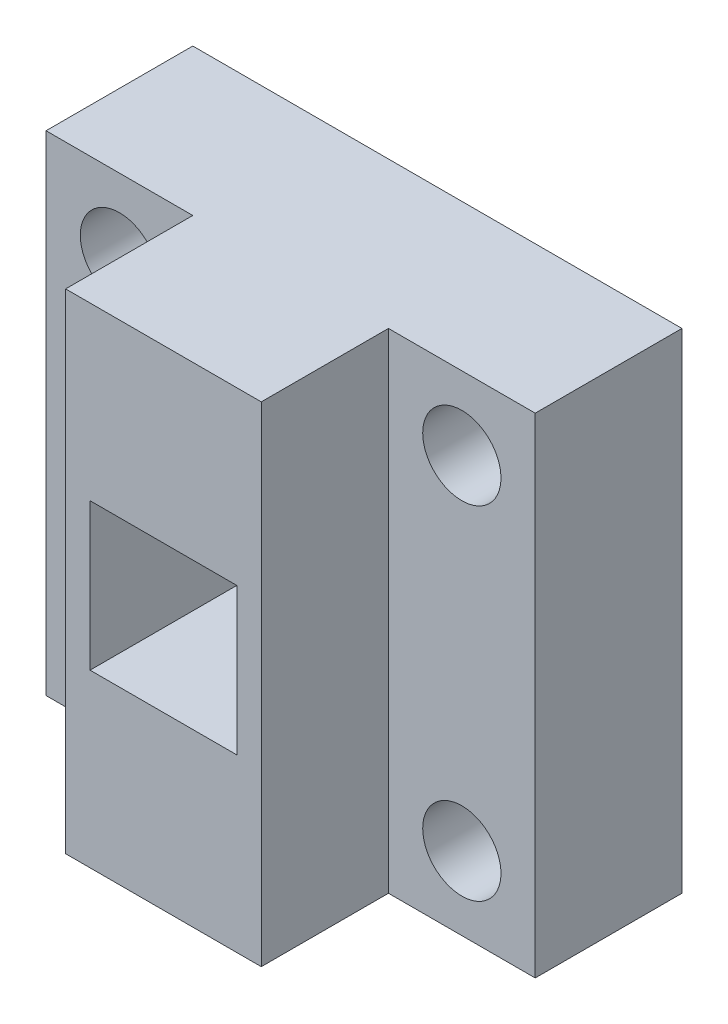
ISO-10303-21;
HEADER;
FILE_DESCRIPTION(('STEP AP214'),'2;1');
FILE_NAME('part.step','',(''),(''),'','','');
FILE_SCHEMA(('AUTOMOTIVE_DESIGN { 1 0 10303 214 1 1 1 1 }'));
ENDSEC;
DATA;
#1=APPLICATION_CONTEXT('core data for automotive mechanical design processes');
#2=APPLICATION_PROTOCOL_DEFINITION('international standard','automotive_design',2000,#1);
#3=PRODUCT_CONTEXT('',#1,'mechanical');
#4=PRODUCT('Part','Part','',(#3));
#5=PRODUCT_RELATED_PRODUCT_CATEGORY('part','',(#4));
#6=PRODUCT_DEFINITION_FORMATION('','',#4);
#7=PRODUCT_DEFINITION_CONTEXT('part definition',#1,'design');
#8=PRODUCT_DEFINITION('design','',#6,#7);
#9=PRODUCT_DEFINITION_SHAPE('','',#8);
#10=(LENGTH_UNIT() NAMED_UNIT(*) SI_UNIT(.MILLI.,.METRE.));
#11=(NAMED_UNIT(*) PLANE_ANGLE_UNIT() SI_UNIT($,.RADIAN.));
#12=(NAMED_UNIT(*) SI_UNIT($,.STERADIAN.) SOLID_ANGLE_UNIT());
#13=UNCERTAINTY_MEASURE_WITH_UNIT(LENGTH_MEASURE(1.E-05),#10,'distance_accuracy_value','');
#14=(GEOMETRIC_REPRESENTATION_CONTEXT(3) GLOBAL_UNCERTAINTY_ASSIGNED_CONTEXT((#13)) GLOBAL_UNIT_ASSIGNED_CONTEXT((#10,
#11,#12)) REPRESENTATION_CONTEXT('',''));
#15=CARTESIAN_POINT('',(0.,0.,0.));
#16=DIRECTION('',(0.,0.,1.));
#17=DIRECTION('',(1.,0.,0.));
#18=AXIS2_PLACEMENT_3D('',#15,#16,#17);
#19=CARTESIAN_POINT('',(0.,0.,0.));
#20=DIRECTION('',(0.,0.,-1.));
#21=DIRECTION('',(-1.,0.,0.));
#22=AXIS2_PLACEMENT_3D('',#19,#20,#21);
#23=PLANE('',#22);
#24=CARTESIAN_POINT('',(17.5,17.5,0.));
#25=DIRECTION('',(0.,0.,1.));
#26=DIRECTION('',(-1.,0.,0.));
#27=AXIS2_PLACEMENT_3D('',#24,#25,#26);
#28=CIRCLE('',#27,4.);
#29=CARTESIAN_POINT('',(13.5,17.5,0.));
#30=VERTEX_POINT('',#29);
#31=EDGE_CURVE('E204',#30,#30,#28,.T.);
#32=ORIENTED_EDGE('',*,*,#31,.T.);
#33=EDGE_LOOP('',(#32));
#34=FACE_BOUND('',#33,.T.);
#35=CARTESIAN_POINT('',(17.5,-17.5,0.));
#36=DIRECTION('',(0.,0.,-1.));
#37=DIRECTION('',(-1.,0.,0.));
#38=AXIS2_PLACEMENT_3D('',#35,#36,#37);
#39=CIRCLE('',#38,4.);
#40=CARTESIAN_POINT('',(13.5,-17.5,0.));
#41=VERTEX_POINT('',#40);
#42=EDGE_CURVE('E220',#41,#41,#39,.T.);
#43=ORIENTED_EDGE('',*,*,#42,.F.);
#44=EDGE_LOOP('',(#43));
#45=FACE_BOUND('',#44,.T.);
#46=DIRECTION('',(0.,1.,0.));
#47=VECTOR('',#46,1.);
#48=CARTESIAN_POINT('',(7.5,-7.5,0.));
#49=LINE('',#48,#47);
#50=CARTESIAN_POINT('',(7.5,-7.5,0.));
#51=VERTEX_POINT('',#50);
#52=CARTESIAN_POINT('',(7.5,7.5,0.));
#53=VERTEX_POINT('',#52);
#54=EDGE_CURVE('E140',#51,#53,#49,.T.);
#55=ORIENTED_EDGE('',*,*,#54,.T.);
#56=DIRECTION('',(-1.,0.,0.));
#57=VECTOR('',#56,1.);
#58=CARTESIAN_POINT('',(-7.5,7.5,0.));
#59=LINE('',#58,#57);
#60=CARTESIAN_POINT('',(-7.5,7.5,0.));
#61=VERTEX_POINT('',#60);
#62=EDGE_CURVE('E149',#53,#61,#59,.T.);
#63=ORIENTED_EDGE('',*,*,#62,.T.);
#64=DIRECTION('',(0.,-1.,0.));
#65=VECTOR('',#64,1.);
#66=CARTESIAN_POINT('',(-7.5,-7.5,0.));
#67=LINE('',#66,#65);
#68=CARTESIAN_POINT('',(-7.5,-7.5,0.));
#69=VERTEX_POINT('',#68);
#70=EDGE_CURVE('E64',#61,#69,#67,.T.);
#71=ORIENTED_EDGE('',*,*,#70,.T.);
#72=DIRECTION('',(1.,0.,0.));
#73=VECTOR('',#72,1.);
#74=CARTESIAN_POINT('',(-7.5,-7.5,0.));
#75=LINE('',#74,#73);
#76=EDGE_CURVE('E146',#69,#51,#75,.T.);
#77=ORIENTED_EDGE('',*,*,#76,.T.);
#78=EDGE_LOOP('',(#55,#63,#71,#77));
#79=FACE_BOUND('',#78,.T.);
#80=DIRECTION('',(0.,1.,0.));
#81=VECTOR('',#80,1.);
#82=CARTESIAN_POINT('',(25.,-25.,0.));
#83=LINE('',#82,#81);
#84=CARTESIAN_POINT('',(25.,-25.,0.));
#85=VERTEX_POINT('',#84);
#86=CARTESIAN_POINT('',(25.,25.,0.));
#87=VERTEX_POINT('',#86);
#88=EDGE_CURVE('E281',#85,#87,#83,.T.);
#89=ORIENTED_EDGE('',*,*,#88,.F.);
#90=DIRECTION('',(1.,0.,0.));
#91=VECTOR('',#90,1.);
#92=CARTESIAN_POINT('',(-25.,-25.,0.));
#93=LINE('',#92,#91);
#94=CARTESIAN_POINT('',(-25.,-25.,0.));
#95=VERTEX_POINT('',#94);
#96=EDGE_CURVE('E290',#95,#85,#93,.T.);
#97=ORIENTED_EDGE('',*,*,#96,.F.);
#98=DIRECTION('',(0.,-1.,0.));
#99=VECTOR('',#98,1.);
#100=CARTESIAN_POINT('',(-25.,-25.,0.));
#101=LINE('',#100,#99);
#102=CARTESIAN_POINT('',(-25.,25.,0.));
#103=VERTEX_POINT('',#102);
#104=EDGE_CURVE('E280',#103,#95,#101,.T.);
#105=ORIENTED_EDGE('',*,*,#104,.F.);
#106=DIRECTION('',(-1.,0.,0.));
#107=VECTOR('',#106,1.);
#108=CARTESIAN_POINT('',(-25.,25.,0.));
#109=LINE('',#108,#107);
#110=EDGE_CURVE('E272',#87,#103,#109,.T.);
#111=ORIENTED_EDGE('',*,*,#110,.F.);
#112=EDGE_LOOP('',(#89,#97,#105,#111));
#113=FACE_BOUND('',#112,.T.);
#114=CARTESIAN_POINT('',(-17.5,17.5,0.));
#115=DIRECTION('',(0.,0.,-1.));
#116=DIRECTION('',(1.,0.,0.));
#117=AXIS2_PLACEMENT_3D('',#114,#115,#116);
#118=CIRCLE('',#117,4.);
#119=CARTESIAN_POINT('',(-13.5,17.5,0.));
#120=VERTEX_POINT('',#119);
#121=EDGE_CURVE('E205',#120,#120,#118,.T.);
#122=ORIENTED_EDGE('',*,*,#121,.F.);
#123=EDGE_LOOP('',(#122));
#124=FACE_BOUND('',#123,.T.);
#125=CARTESIAN_POINT('',(-17.5,-17.5,0.));
#126=DIRECTION('',(0.,0.,1.));
#127=DIRECTION('',(1.,0.,0.));
#128=AXIS2_PLACEMENT_3D('',#125,#126,#127);
#129=CIRCLE('',#128,4.);
#130=CARTESIAN_POINT('',(-13.5,-17.5,0.));
#131=VERTEX_POINT('',#130);
#132=EDGE_CURVE('E216',#131,#131,#129,.T.);
#133=ORIENTED_EDGE('',*,*,#132,.T.);
#134=EDGE_LOOP('',(#133));
#135=FACE_BOUND('',#134,.T.);
#136=ADVANCED_FACE('F47',(#34,#45,#79,#113,#124,#135),#23,.T.);
#137=CARTESIAN_POINT('',(0.,0.,15.));
#138=DIRECTION('',(0.,0.,-1.));
#139=DIRECTION('',(-1.,0.,0.));
#140=AXIS2_PLACEMENT_3D('',#137,#138,#139);
#141=PLANE('',#140);
#142=DIRECTION('',(0.,-1.,0.));
#143=VECTOR('',#142,1.);
#144=CARTESIAN_POINT('',(-10.,-25.,15.));
#145=LINE('',#144,#143);
#146=CARTESIAN_POINT('',(-10.,25.,15.));
#147=VERTEX_POINT('',#146);
#148=CARTESIAN_POINT('',(-10.,-25.,15.));
#149=VERTEX_POINT('',#148);
#150=EDGE_CURVE('E181',#147,#149,#145,.T.);
#151=ORIENTED_EDGE('',*,*,#150,.F.);
#152=DIRECTION('',(-1.,0.,0.));
#153=VECTOR('',#152,1.);
#154=CARTESIAN_POINT('',(-25.,25.,15.));
#155=LINE('',#154,#153);
#156=CARTESIAN_POINT('',(-25.,25.,15.));
#157=VERTEX_POINT('',#156);
#158=EDGE_CURVE('E304',#147,#157,#155,.T.);
#159=ORIENTED_EDGE('',*,*,#158,.T.);
#160=DIRECTION('',(0.,-1.,0.));
#161=VECTOR('',#160,1.);
#162=CARTESIAN_POINT('',(-25.,-25.,15.));
#163=LINE('',#162,#161);
#164=CARTESIAN_POINT('',(-25.,-25.,15.));
#165=VERTEX_POINT('',#164);
#166=EDGE_CURVE('E285',#157,#165,#163,.T.);
#167=ORIENTED_EDGE('',*,*,#166,.T.);
#168=DIRECTION('',(1.,0.,0.));
#169=VECTOR('',#168,1.);
#170=CARTESIAN_POINT('',(-25.,-25.,15.));
#171=LINE('',#170,#169);
#172=EDGE_CURVE('E299',#165,#149,#171,.T.);
#173=ORIENTED_EDGE('',*,*,#172,.T.);
#174=EDGE_LOOP('',(#151,#159,#167,#173));
#175=FACE_BOUND('',#174,.T.);
#176=CARTESIAN_POINT('',(-17.5,17.5,15.));
#177=DIRECTION('',(0.,0.,-1.));
#178=DIRECTION('',(-1.,0.,0.));
#179=AXIS2_PLACEMENT_3D('',#176,#177,#178);
#180=CIRCLE('',#179,4.);
#181=CARTESIAN_POINT('',(-21.5,17.5,15.));
#182=VERTEX_POINT('',#181);
#183=EDGE_CURVE('E202',#182,#182,#180,.T.);
#184=ORIENTED_EDGE('',*,*,#183,.T.);
#185=EDGE_LOOP('',(#184));
#186=FACE_BOUND('',#185,.T.);
#187=CARTESIAN_POINT('',(-17.5,-17.5,15.));
#188=DIRECTION('',(0.,0.,-1.));
#189=DIRECTION('',(-1.,0.,0.));
#190=AXIS2_PLACEMENT_3D('',#187,#188,#189);
#191=CIRCLE('',#190,4.);
#192=CARTESIAN_POINT('',(-21.5,-17.5,15.));
#193=VERTEX_POINT('',#192);
#194=EDGE_CURVE('E51',#193,#193,#191,.F.);
#195=ORIENTED_EDGE('',*,*,#194,.F.);
#196=EDGE_LOOP('',(#195));
#197=FACE_BOUND('',#196,.T.);
#198=ADVANCED_FACE('F245',(#175,#186,#197),#141,.F.);
#199=DIRECTION('',(0.,1.,0.));
#200=VECTOR('',#199,1.);
#201=CARTESIAN_POINT('',(10.,-25.,15.));
#202=LINE('',#201,#200);
#203=CARTESIAN_POINT('',(10.,-25.,15.));
#204=VERTEX_POINT('',#203);
#205=CARTESIAN_POINT('',(10.,25.,15.));
#206=VERTEX_POINT('',#205);
#207=EDGE_CURVE('E173',#204,#206,#202,.T.);
#208=ORIENTED_EDGE('',*,*,#207,.F.);
#209=CARTESIAN_POINT('',(25.,-25.,15.));
#210=VERTEX_POINT('',#209);
#211=EDGE_CURVE('E310',#204,#210,#171,.T.);
#212=ORIENTED_EDGE('',*,*,#211,.T.);
#213=DIRECTION('',(0.,1.,0.));
#214=VECTOR('',#213,1.);
#215=CARTESIAN_POINT('',(25.,-25.,15.));
#216=LINE('',#215,#214);
#217=CARTESIAN_POINT('',(25.,25.,15.));
#218=VERTEX_POINT('',#217);
#219=EDGE_CURVE('E292',#210,#218,#216,.T.);
#220=ORIENTED_EDGE('',*,*,#219,.T.);
#221=EDGE_CURVE('E301',#218,#206,#155,.T.);
#222=ORIENTED_EDGE('',*,*,#221,.T.);
#223=EDGE_LOOP('',(#208,#212,#220,#222));
#224=FACE_BOUND('',#223,.T.);
#225=CARTESIAN_POINT('',(17.5,-17.5,15.));
#226=DIRECTION('',(0.,0.,-1.));
#227=DIRECTION('',(-1.,0.,0.));
#228=AXIS2_PLACEMENT_3D('',#225,#226,#227);
#229=CIRCLE('',#228,4.);
#230=CARTESIAN_POINT('',(13.5,-17.5,15.));
#231=VERTEX_POINT('',#230);
#232=EDGE_CURVE('E161',#231,#231,#229,.T.);
#233=ORIENTED_EDGE('',*,*,#232,.T.);
#234=EDGE_LOOP('',(#233));
#235=FACE_BOUND('',#234,.T.);
#236=CARTESIAN_POINT('',(17.5,17.5,15.));
#237=DIRECTION('',(0.,0.,-1.));
#238=DIRECTION('',(-1.,0.,0.));
#239=AXIS2_PLACEMENT_3D('',#236,#237,#238);
#240=CIRCLE('',#239,4.);
#241=CARTESIAN_POINT('',(13.5,17.5,15.));
#242=VERTEX_POINT('',#241);
#243=EDGE_CURVE('E209',#242,#242,#240,.F.);
#244=ORIENTED_EDGE('',*,*,#243,.F.);
#245=EDGE_LOOP('',(#244));
#246=FACE_BOUND('',#245,.T.);
#247=ADVANCED_FACE('F227',(#224,#235,#246),#141,.F.);
#248=CARTESIAN_POINT('',(25.,-25.,15.));
#249=DIRECTION('',(-1.,0.,0.));
#250=DIRECTION('',(0.,0.,1.));
#251=AXIS2_PLACEMENT_3D('',#248,#249,#250);
#252=PLANE('',#251);
#253=ORIENTED_EDGE('',*,*,#88,.T.);
#254=DIRECTION('',(0.,0.,-1.));
#255=VECTOR('',#254,1.);
#256=CARTESIAN_POINT('',(25.,25.,15.));
#257=LINE('',#256,#255);
#258=EDGE_CURVE('E13',#218,#87,#257,.T.);
#259=ORIENTED_EDGE('',*,*,#258,.F.);
#260=ORIENTED_EDGE('',*,*,#219,.F.);
#261=DIRECTION('',(0.,0.,-1.));
#262=VECTOR('',#261,1.);
#263=CARTESIAN_POINT('',(25.,-25.,15.));
#264=LINE('',#263,#262);
#265=EDGE_CURVE('E296',#210,#85,#264,.T.);
#266=ORIENTED_EDGE('',*,*,#265,.T.);
#267=EDGE_LOOP('',(#253,#259,#260,#266));
#268=FACE_BOUND('',#267,.T.);
#269=ADVANCED_FACE('F49',(#268),#252,.F.);
#270=CARTESIAN_POINT('',(-25.,25.,15.));
#271=DIRECTION('',(0.,-1.,0.));
#272=DIRECTION('',(0.,0.,-1.));
#273=AXIS2_PLACEMENT_3D('',#270,#271,#272);
#274=PLANE('',#273);
#275=ORIENTED_EDGE('',*,*,#110,.T.);
#276=DIRECTION('',(0.,0.,-1.));
#277=VECTOR('',#276,1.);
#278=CARTESIAN_POINT('',(-25.,25.,15.));
#279=LINE('',#278,#277);
#280=EDGE_CURVE('E56',#157,#103,#279,.T.);
#281=ORIENTED_EDGE('',*,*,#280,.F.);
#282=ORIENTED_EDGE('',*,*,#158,.F.);
#283=DIRECTION('',(0.,0.,-1.));
#284=VECTOR('',#283,1.);
#285=CARTESIAN_POINT('',(-10.,25.,28.));
#286=LINE('',#285,#284);
#287=CARTESIAN_POINT('',(-10.,25.,28.));
#288=VERTEX_POINT('',#287);
#289=EDGE_CURVE('E325',#288,#147,#286,.T.);
#290=ORIENTED_EDGE('',*,*,#289,.F.);
#291=DIRECTION('',(-1.,0.,0.));
#292=VECTOR('',#291,1.);
#293=CARTESIAN_POINT('',(-10.,25.,28.));
#294=LINE('',#293,#292);
#295=CARTESIAN_POINT('',(10.,25.,28.));
#296=VERTEX_POINT('',#295);
#297=EDGE_CURVE('E180',#296,#288,#294,.T.);
#298=ORIENTED_EDGE('',*,*,#297,.F.);
#299=DIRECTION('',(0.,0.,-1.));
#300=VECTOR('',#299,1.);
#301=CARTESIAN_POINT('',(10.,25.,28.));
#302=LINE('',#301,#300);
#303=EDGE_CURVE('E331',#296,#206,#302,.T.);
#304=ORIENTED_EDGE('',*,*,#303,.T.);
#305=ORIENTED_EDGE('',*,*,#221,.F.);
#306=ORIENTED_EDGE('',*,*,#258,.T.);
#307=EDGE_LOOP('',(#275,#281,#282,#290,#298,#304,#305,#306));
#308=FACE_BOUND('',#307,.T.);
#309=ADVANCED_FACE('F263',(#308),#274,.F.);
#310=CARTESIAN_POINT('',(-25.,-25.,15.));
#311=DIRECTION('',(1.,0.,0.));
#312=DIRECTION('',(0.,0.,-1.));
#313=AXIS2_PLACEMENT_3D('',#310,#311,#312);
#314=PLANE('',#313);
#315=ORIENTED_EDGE('',*,*,#104,.T.);
#316=DIRECTION('',(0.,0.,-1.));
#317=VECTOR('',#316,1.);
#318=CARTESIAN_POINT('',(-25.,-25.,15.));
#319=LINE('',#318,#317);
#320=EDGE_CURVE('E286',#165,#95,#319,.T.);
#321=ORIENTED_EDGE('',*,*,#320,.F.);
#322=ORIENTED_EDGE('',*,*,#166,.F.);
#323=ORIENTED_EDGE('',*,*,#280,.T.);
#324=EDGE_LOOP('',(#315,#321,#322,#323));
#325=FACE_BOUND('',#324,.T.);
#326=ADVANCED_FACE('F260',(#325),#314,.F.);
#327=CARTESIAN_POINT('',(-25.,-25.,15.));
#328=DIRECTION('',(0.,1.,0.));
#329=DIRECTION('',(0.,0.,1.));
#330=AXIS2_PLACEMENT_3D('',#327,#328,#329);
#331=PLANE('',#330);
#332=ORIENTED_EDGE('',*,*,#96,.T.);
#333=ORIENTED_EDGE('',*,*,#265,.F.);
#334=ORIENTED_EDGE('',*,*,#211,.F.);
#335=DIRECTION('',(0.,0.,-1.));
#336=VECTOR('',#335,1.);
#337=CARTESIAN_POINT('',(10.,-25.,28.));
#338=LINE('',#337,#336);
#339=CARTESIAN_POINT('',(10.,-25.,28.));
#340=VERTEX_POINT('',#339);
#341=EDGE_CURVE('E187',#340,#204,#338,.T.);
#342=ORIENTED_EDGE('',*,*,#341,.F.);
#343=DIRECTION('',(1.,0.,0.));
#344=VECTOR('',#343,1.);
#345=CARTESIAN_POINT('',(-10.,-25.,28.));
#346=LINE('',#345,#344);
#347=CARTESIAN_POINT('',(-10.,-25.,28.));
#348=VERTEX_POINT('',#347);
#349=EDGE_CURVE('E185',#348,#340,#346,.T.);
#350=ORIENTED_EDGE('',*,*,#349,.F.);
#351=DIRECTION('',(0.,0.,-1.));
#352=VECTOR('',#351,1.);
#353=CARTESIAN_POINT('',(-10.,-25.,28.));
#354=LINE('',#353,#352);
#355=EDGE_CURVE('E200',#348,#149,#354,.T.);
#356=ORIENTED_EDGE('',*,*,#355,.T.);
#357=ORIENTED_EDGE('',*,*,#172,.F.);
#358=ORIENTED_EDGE('',*,*,#320,.T.);
#359=EDGE_LOOP('',(#332,#333,#334,#342,#350,#356,#357,#358));
#360=FACE_BOUND('',#359,.T.);
#361=ADVANCED_FACE('F256',(#360),#331,.F.);
#362=CARTESIAN_POINT('',(10.,-25.,28.));
#363=DIRECTION('',(-1.,0.,0.));
#364=DIRECTION('',(0.,0.,1.));
#365=AXIS2_PLACEMENT_3D('',#362,#363,#364);
#366=PLANE('',#365);
#367=ORIENTED_EDGE('',*,*,#207,.T.);
#368=ORIENTED_EDGE('',*,*,#303,.F.);
#369=DIRECTION('',(0.,1.,0.));
#370=VECTOR('',#369,1.);
#371=CARTESIAN_POINT('',(10.,-25.,28.));
#372=LINE('',#371,#370);
#373=EDGE_CURVE('E177',#340,#296,#372,.T.);
#374=ORIENTED_EDGE('',*,*,#373,.F.);
#375=ORIENTED_EDGE('',*,*,#341,.T.);
#376=EDGE_LOOP('',(#367,#368,#374,#375));
#377=FACE_BOUND('',#376,.T.);
#378=ADVANCED_FACE('F259',(#377),#366,.F.);
#379=CARTESIAN_POINT('',(-10.,-25.,28.));
#380=DIRECTION('',(1.,0.,0.));
#381=DIRECTION('',(0.,0.,-1.));
#382=AXIS2_PLACEMENT_3D('',#379,#380,#381);
#383=PLANE('',#382);
#384=ORIENTED_EDGE('',*,*,#150,.T.);
#385=ORIENTED_EDGE('',*,*,#355,.F.);
#386=DIRECTION('',(0.,-1.,0.));
#387=VECTOR('',#386,1.);
#388=CARTESIAN_POINT('',(-10.,-25.,28.));
#389=LINE('',#388,#387);
#390=EDGE_CURVE('E183',#288,#348,#389,.T.);
#391=ORIENTED_EDGE('',*,*,#390,.F.);
#392=ORIENTED_EDGE('',*,*,#289,.T.);
#393=EDGE_LOOP('',(#384,#385,#391,#392));
#394=FACE_BOUND('',#393,.T.);
#395=ADVANCED_FACE('F328',(#394),#383,.F.);
#396=CARTESIAN_POINT('',(0.,0.,28.));
#397=DIRECTION('',(0.,0.,-1.));
#398=DIRECTION('',(-1.,0.,0.));
#399=AXIS2_PLACEMENT_3D('',#396,#397,#398);
#400=PLANE('',#399);
#401=DIRECTION('',(-1.,0.,0.));
#402=VECTOR('',#401,1.);
#403=CARTESIAN_POINT('',(-7.5,7.5,28.));
#404=LINE('',#403,#402);
#405=CARTESIAN_POINT('',(7.5,7.5,28.));
#406=VERTEX_POINT('',#405);
#407=CARTESIAN_POINT('',(-7.5,7.5,28.));
#408=VERTEX_POINT('',#407);
#409=EDGE_CURVE('E167',#406,#408,#404,.T.);
#410=ORIENTED_EDGE('',*,*,#409,.F.);
#411=DIRECTION('',(0.,1.,0.));
#412=VECTOR('',#411,1.);
#413=CARTESIAN_POINT('',(7.5,-7.5,28.));
#414=LINE('',#413,#412);
#415=CARTESIAN_POINT('',(7.5,-7.5,28.));
#416=VERTEX_POINT('',#415);
#417=EDGE_CURVE('E72',#416,#406,#414,.T.);
#418=ORIENTED_EDGE('',*,*,#417,.F.);
#419=DIRECTION('',(1.,0.,0.));
#420=VECTOR('',#419,1.);
#421=CARTESIAN_POINT('',(-7.5,-7.5,28.));
#422=LINE('',#421,#420);
#423=CARTESIAN_POINT('',(-7.5,-7.5,28.));
#424=VERTEX_POINT('',#423);
#425=EDGE_CURVE('E155',#424,#416,#422,.T.);
#426=ORIENTED_EDGE('',*,*,#425,.F.);
#427=DIRECTION('',(0.,-1.,0.));
#428=VECTOR('',#427,1.);
#429=CARTESIAN_POINT('',(-7.5,-7.5,28.));
#430=LINE('',#429,#428);
#431=EDGE_CURVE('E158',#408,#424,#430,.T.);
#432=ORIENTED_EDGE('',*,*,#431,.F.);
#433=EDGE_LOOP('',(#410,#418,#426,#432));
#434=FACE_BOUND('',#433,.T.);
#435=ORIENTED_EDGE('',*,*,#373,.T.);
#436=ORIENTED_EDGE('',*,*,#297,.T.);
#437=ORIENTED_EDGE('',*,*,#390,.T.);
#438=ORIENTED_EDGE('',*,*,#349,.T.);
#439=EDGE_LOOP('',(#435,#436,#437,#438));
#440=FACE_BOUND('',#439,.T.);
#441=ADVANCED_FACE('F342',(#434,#440),#400,.F.);
#442=CARTESIAN_POINT('',(7.5,-7.5,0.));
#443=DIRECTION('',(1.,0.,0.));
#444=DIRECTION('',(0.,0.,-1.));
#445=AXIS2_PLACEMENT_3D('',#442,#443,#444);
#446=PLANE('',#445);
#447=ORIENTED_EDGE('',*,*,#417,.T.);
#448=DIRECTION('',(0.,0.,1.));
#449=VECTOR('',#448,1.);
#450=CARTESIAN_POINT('',(7.5,7.5,0.));
#451=LINE('',#450,#449);
#452=EDGE_CURVE('E136',#53,#406,#451,.T.);
#453=ORIENTED_EDGE('',*,*,#452,.F.);
#454=ORIENTED_EDGE('',*,*,#54,.F.);
#455=DIRECTION('',(0.,0.,1.));
#456=VECTOR('',#455,1.);
#457=CARTESIAN_POINT('',(7.5,-7.5,0.));
#458=LINE('',#457,#456);
#459=EDGE_CURVE('E171',#51,#416,#458,.T.);
#460=ORIENTED_EDGE('',*,*,#459,.T.);
#461=EDGE_LOOP('',(#447,#453,#454,#460));
#462=FACE_BOUND('',#461,.T.);
#463=ADVANCED_FACE('F138',(#462),#446,.F.);
#464=CARTESIAN_POINT('',(-7.5,-7.5,0.));
#465=DIRECTION('',(0.,-1.,0.));
#466=DIRECTION('',(0.,0.,-1.));
#467=AXIS2_PLACEMENT_3D('',#464,#465,#466);
#468=PLANE('',#467);
#469=ORIENTED_EDGE('',*,*,#425,.T.);
#470=ORIENTED_EDGE('',*,*,#459,.F.);
#471=ORIENTED_EDGE('',*,*,#76,.F.);
#472=DIRECTION('',(0.,0.,1.));
#473=VECTOR('',#472,1.);
#474=CARTESIAN_POINT('',(-7.5,-7.5,0.));
#475=LINE('',#474,#473);
#476=EDGE_CURVE('E174',#69,#424,#475,.T.);
#477=ORIENTED_EDGE('',*,*,#476,.T.);
#478=EDGE_LOOP('',(#469,#470,#471,#477));
#479=FACE_BOUND('',#478,.T.);
#480=ADVANCED_FACE('F355',(#479),#468,.F.);
#481=CARTESIAN_POINT('',(-7.5,-7.5,0.));
#482=DIRECTION('',(-1.,0.,0.));
#483=DIRECTION('',(0.,0.,1.));
#484=AXIS2_PLACEMENT_3D('',#481,#482,#483);
#485=PLANE('',#484);
#486=ORIENTED_EDGE('',*,*,#431,.T.);
#487=ORIENTED_EDGE('',*,*,#476,.F.);
#488=ORIENTED_EDGE('',*,*,#70,.F.);
#489=DIRECTION('',(0.,0.,1.));
#490=VECTOR('',#489,1.);
#491=CARTESIAN_POINT('',(-7.5,7.5,0.));
#492=LINE('',#491,#490);
#493=EDGE_CURVE('E145',#61,#408,#492,.T.);
#494=ORIENTED_EDGE('',*,*,#493,.T.);
#495=EDGE_LOOP('',(#486,#487,#488,#494));
#496=FACE_BOUND('',#495,.T.);
#497=ADVANCED_FACE('F241',(#496),#485,.F.);
#498=CARTESIAN_POINT('',(-7.5,7.5,0.));
#499=DIRECTION('',(0.,1.,0.));
#500=DIRECTION('',(0.,0.,1.));
#501=AXIS2_PLACEMENT_3D('',#498,#499,#500);
#502=PLANE('',#501);
#503=ORIENTED_EDGE('',*,*,#409,.T.);
#504=ORIENTED_EDGE('',*,*,#493,.F.);
#505=ORIENTED_EDGE('',*,*,#62,.F.);
#506=ORIENTED_EDGE('',*,*,#452,.T.);
#507=EDGE_LOOP('',(#503,#504,#505,#506));
#508=FACE_BOUND('',#507,.T.);
#509=ADVANCED_FACE('F150',(#508),#502,.F.);
#510=CARTESIAN_POINT('',(17.5,-17.5,28.000025));
#511=DIRECTION('',(0.,0.,-1.));
#512=DIRECTION('',(-1.,0.,0.));
#513=AXIS2_PLACEMENT_3D('',#510,#511,#512);
#514=CYLINDRICAL_SURFACE('',#513,4.);
#515=ORIENTED_EDGE('',*,*,#42,.T.);
#516=EDGE_LOOP('',(#515));
#517=FACE_BOUND('',#516,.T.);
#518=ORIENTED_EDGE('',*,*,#232,.F.);
#519=EDGE_LOOP('',(#518));
#520=FACE_BOUND('',#519,.T.);
#521=ADVANCED_FACE('F230',(#517,#520),#514,.F.);
#522=CARTESIAN_POINT('',(17.5,17.5,28.000025));
#523=DIRECTION('',(0.,0.,-1.));
#524=DIRECTION('',(-1.,0.,0.));
#525=AXIS2_PLACEMENT_3D('',#522,#523,#524);
#526=CYLINDRICAL_SURFACE('',#525,4.);
#527=ORIENTED_EDGE('',*,*,#31,.F.);
#528=EDGE_LOOP('',(#527));
#529=FACE_BOUND('',#528,.T.);
#530=ORIENTED_EDGE('',*,*,#243,.T.);
#531=EDGE_LOOP('',(#530));
#532=FACE_BOUND('',#531,.T.);
#533=ADVANCED_FACE('F232',(#529,#532),#526,.F.);
#534=CARTESIAN_POINT('',(-17.5,17.5,28.000025));
#535=DIRECTION('',(0.,0.,-1.));
#536=DIRECTION('',(-1.,0.,0.));
#537=AXIS2_PLACEMENT_3D('',#534,#535,#536);
#538=CYLINDRICAL_SURFACE('',#537,4.);
#539=ORIENTED_EDGE('',*,*,#121,.T.);
#540=EDGE_LOOP('',(#539));
#541=FACE_BOUND('',#540,.T.);
#542=ORIENTED_EDGE('',*,*,#183,.F.);
#543=EDGE_LOOP('',(#542));
#544=FACE_BOUND('',#543,.T.);
#545=ADVANCED_FACE('F238',(#541,#544),#538,.F.);
#546=CARTESIAN_POINT('',(-17.5,-17.5,28.000025));
#547=DIRECTION('',(0.,0.,-1.));
#548=DIRECTION('',(-1.,0.,0.));
#549=AXIS2_PLACEMENT_3D('',#546,#547,#548);
#550=CYLINDRICAL_SURFACE('',#549,4.);
#551=ORIENTED_EDGE('',*,*,#132,.F.);
#552=EDGE_LOOP('',(#551));
#553=FACE_BOUND('',#552,.T.);
#554=ORIENTED_EDGE('',*,*,#194,.T.);
#555=EDGE_LOOP('',(#554));
#556=FACE_BOUND('',#555,.T.);
#557=ADVANCED_FACE('F410',(#553,#556),#550,.F.);
#558=CLOSED_SHELL('',(#136,#198,#247,#269,#309,#326,#361,#378,#395,#441,#463,#480,#497,#509,
#521,#533,#545,#557));
#559=MANIFOLD_SOLID_BREP('B2',#558);
#560=ADVANCED_BREP_SHAPE_REPRESENTATION('',(#18,#559),#14);
#561=SHAPE_DEFINITION_REPRESENTATION(#9,#560);
ENDSEC;
END-ISO-10303-21;
